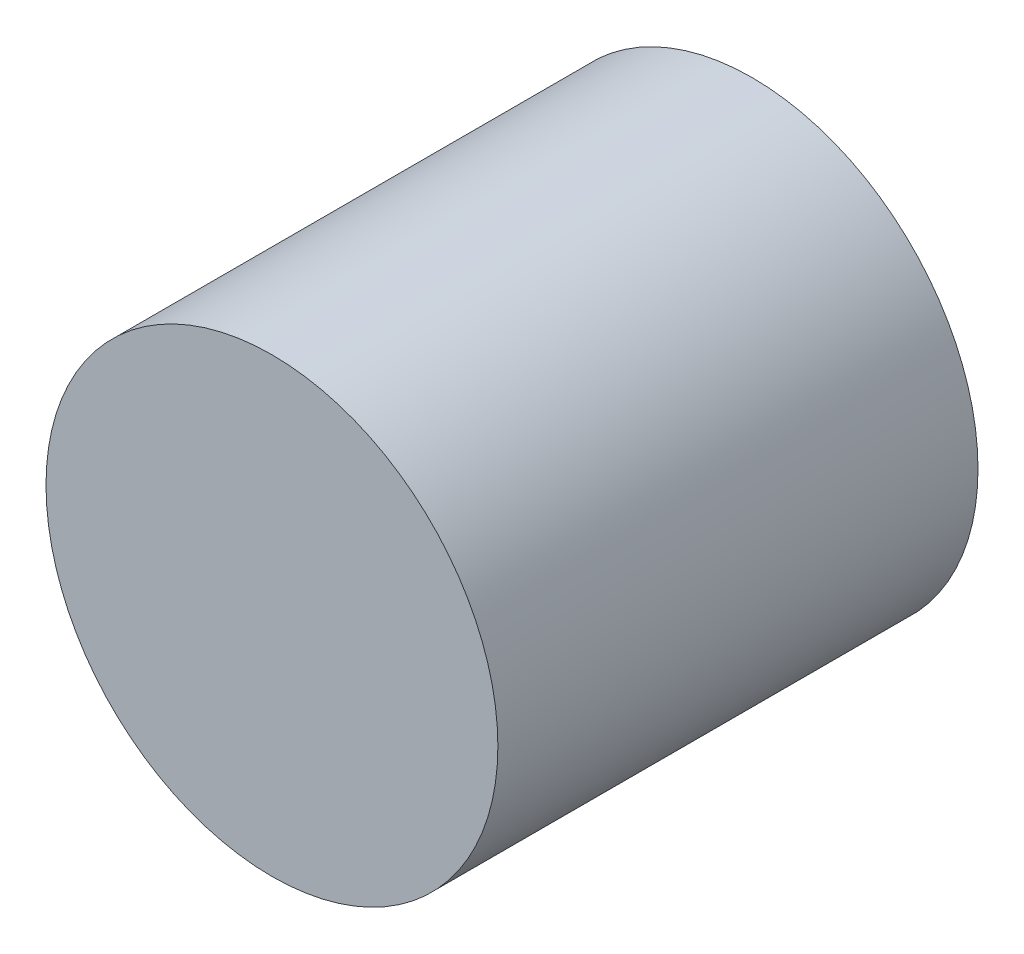
ISO-10303-21;
HEADER;
FILE_DESCRIPTION(('STEP AP214'),'2;1');
FILE_NAME('part.step','',(''),(''),'','','');
FILE_SCHEMA(('AUTOMOTIVE_DESIGN { 1 0 10303 214 1 1 1 1 }'));
ENDSEC;
DATA;
#1=APPLICATION_CONTEXT('core data for automotive mechanical design processes');
#2=APPLICATION_PROTOCOL_DEFINITION('international standard','automotive_design',2000,#1);
#3=PRODUCT_CONTEXT('',#1,'mechanical');
#4=PRODUCT('Part','Part','',(#3));
#5=PRODUCT_RELATED_PRODUCT_CATEGORY('part','',(#4));
#6=PRODUCT_DEFINITION_FORMATION('','',#4);
#7=PRODUCT_DEFINITION_CONTEXT('part definition',#1,'design');
#8=PRODUCT_DEFINITION('design','',#6,#7);
#9=PRODUCT_DEFINITION_SHAPE('','',#8);
#10=(LENGTH_UNIT() NAMED_UNIT(*) SI_UNIT(.MILLI.,.METRE.));
#11=(NAMED_UNIT(*) PLANE_ANGLE_UNIT() SI_UNIT($,.RADIAN.));
#12=(NAMED_UNIT(*) SI_UNIT($,.STERADIAN.) SOLID_ANGLE_UNIT());
#13=UNCERTAINTY_MEASURE_WITH_UNIT(LENGTH_MEASURE(1.E-05),#10,'distance_accuracy_value','');
#14=(GEOMETRIC_REPRESENTATION_CONTEXT(3) GLOBAL_UNCERTAINTY_ASSIGNED_CONTEXT((#13)) GLOBAL_UNIT_ASSIGNED_CONTEXT((#10,
#11,#12)) REPRESENTATION_CONTEXT('',''));
#15=CARTESIAN_POINT('',(0.,0.,0.));
#16=DIRECTION('',(0.,0.,1.));
#17=DIRECTION('',(1.,0.,0.));
#18=AXIS2_PLACEMENT_3D('',#15,#16,#17);
#19=CARTESIAN_POINT('',(0.,0.,8.5));
#20=DIRECTION('',(0.,0.,-1.));
#21=DIRECTION('',(-1.,0.,0.));
#22=AXIS2_PLACEMENT_3D('',#19,#20,#21);
#23=CYLINDRICAL_SURFACE('',#22,4.);
#24=CARTESIAN_POINT('',(0.,0.,8.5));
#25=DIRECTION('',(0.,0.,1.));
#26=DIRECTION('',(1.,0.,0.));
#27=AXIS2_PLACEMENT_3D('',#24,#25,#26);
#28=CIRCLE('',#27,4.);
#29=CARTESIAN_POINT('',(4.,0.,8.5));
#30=VERTEX_POINT('',#29);
#31=EDGE_CURVE('E10',#30,#30,#28,.T.);
#32=ORIENTED_EDGE('',*,*,#31,.F.);
#33=EDGE_LOOP('',(#32));
#34=FACE_BOUND('',#33,.T.);
#35=CARTESIAN_POINT('',(0.,0.,0.));
#36=DIRECTION('',(0.,0.,1.));
#37=DIRECTION('',(1.,0.,0.));
#38=AXIS2_PLACEMENT_3D('',#35,#36,#37);
#39=CIRCLE('',#38,4.);
#40=CARTESIAN_POINT('',(4.,0.,0.));
#41=VERTEX_POINT('',#40);
#42=EDGE_CURVE('E34',#41,#41,#39,.T.);
#43=ORIENTED_EDGE('',*,*,#42,.T.);
#44=EDGE_LOOP('',(#43));
#45=FACE_BOUND('',#44,.T.);
#46=ADVANCED_FACE('F31',(#34,#45),#23,.T.);
#47=CARTESIAN_POINT('',(0.,0.,8.5));
#48=DIRECTION('',(0.,0.,1.));
#49=DIRECTION('',(1.,0.,0.));
#50=AXIS2_PLACEMENT_3D('',#47,#48,#49);
#51=PLANE('',#50);
#52=ORIENTED_EDGE('',*,*,#31,.T.);
#53=EDGE_LOOP('',(#52));
#54=FACE_BOUND('',#53,.T.);
#55=ADVANCED_FACE('F46',(#54),#51,.T.);
#56=CARTESIAN_POINT('',(0.,0.,0.));
#57=DIRECTION('',(0.,0.,1.));
#58=DIRECTION('',(1.,0.,0.));
#59=AXIS2_PLACEMENT_3D('',#56,#57,#58);
#60=PLANE('',#59);
#61=ORIENTED_EDGE('',*,*,#42,.F.);
#62=EDGE_LOOP('',(#61));
#63=FACE_BOUND('',#62,.T.);
#64=ADVANCED_FACE('F44',(#63),#60,.F.);
#65=CLOSED_SHELL('',(#46,#55,#64));
#66=MANIFOLD_SOLID_BREP('B2',#65);
#67=ADVANCED_BREP_SHAPE_REPRESENTATION('',(#18,#66),#14);
#68=SHAPE_DEFINITION_REPRESENTATION(#9,#67);
ENDSEC;
END-ISO-10303-21;
